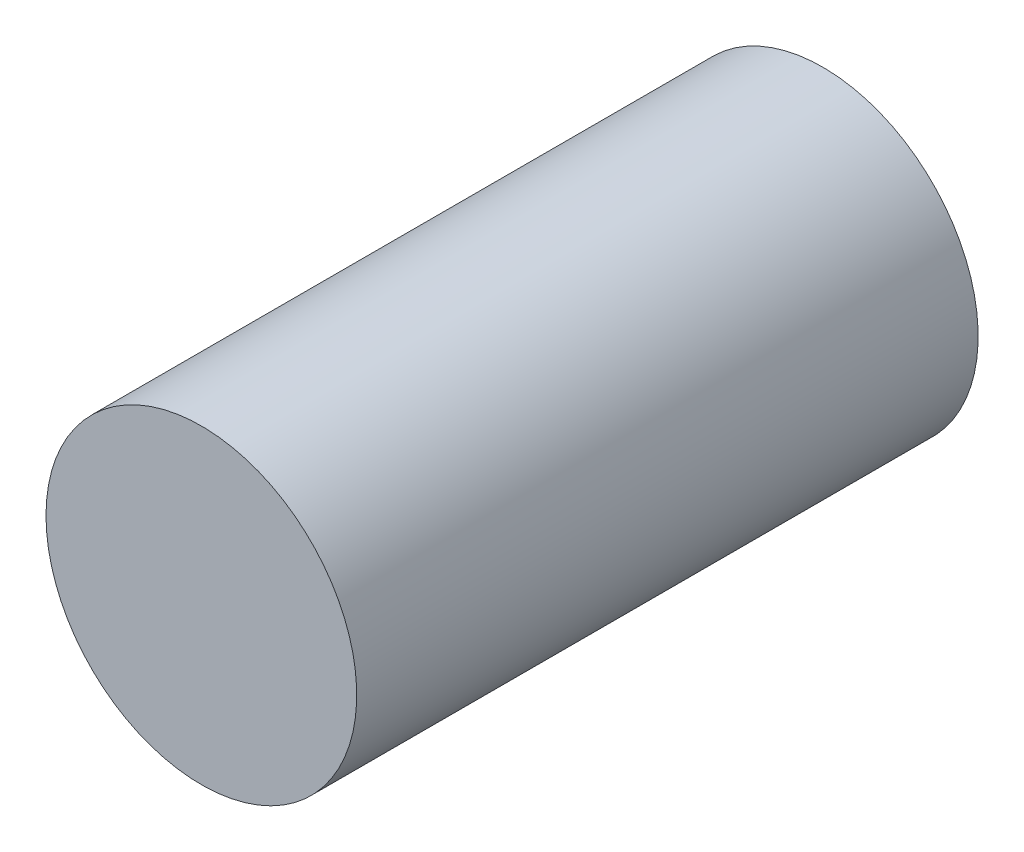
ISO-10303-21;
HEADER;
FILE_DESCRIPTION(('STEP AP214'),'2;1');
FILE_NAME('part.step','',(''),(''),'','','');
FILE_SCHEMA(('AUTOMOTIVE_DESIGN { 1 0 10303 214 1 1 1 1 }'));
ENDSEC;
DATA;
#1=APPLICATION_CONTEXT('core data for automotive mechanical design processes');
#2=APPLICATION_PROTOCOL_DEFINITION('international standard','automotive_design',2000,#1);
#3=PRODUCT_CONTEXT('',#1,'mechanical');
#4=PRODUCT('Part','Part','',(#3));
#5=PRODUCT_RELATED_PRODUCT_CATEGORY('part','',(#4));
#6=PRODUCT_DEFINITION_FORMATION('','',#4);
#7=PRODUCT_DEFINITION_CONTEXT('part definition',#1,'design');
#8=PRODUCT_DEFINITION('design','',#6,#7);
#9=PRODUCT_DEFINITION_SHAPE('','',#8);
#10=(LENGTH_UNIT() NAMED_UNIT(*) SI_UNIT(.MILLI.,.METRE.));
#11=(NAMED_UNIT(*) PLANE_ANGLE_UNIT() SI_UNIT($,.RADIAN.));
#12=(NAMED_UNIT(*) SI_UNIT($,.STERADIAN.) SOLID_ANGLE_UNIT());
#13=UNCERTAINTY_MEASURE_WITH_UNIT(LENGTH_MEASURE(1.E-05),#10,'distance_accuracy_value','');
#14=(GEOMETRIC_REPRESENTATION_CONTEXT(3) GLOBAL_UNCERTAINTY_ASSIGNED_CONTEXT((#13)) GLOBAL_UNIT_ASSIGNED_CONTEXT((#10,
#11,#12)) REPRESENTATION_CONTEXT('',''));
#15=CARTESIAN_POINT('',(0.,0.,0.));
#16=DIRECTION('',(0.,0.,1.));
#17=DIRECTION('',(1.,0.,0.));
#18=AXIS2_PLACEMENT_3D('',#15,#16,#17);
#19=CARTESIAN_POINT('',(0.,0.,26.));
#20=DIRECTION('',(0.,0.,-1.));
#21=DIRECTION('',(-1.,0.,0.));
#22=AXIS2_PLACEMENT_3D('',#19,#20,#21);
#23=CYLINDRICAL_SURFACE('',#22,6.5);
#24=CARTESIAN_POINT('',(0.,0.,26.));
#25=DIRECTION('',(0.,0.,1.));
#26=DIRECTION('',(1.,0.,0.));
#27=AXIS2_PLACEMENT_3D('',#24,#25,#26);
#28=CIRCLE('',#27,6.5);
#29=CARTESIAN_POINT('',(-6.5,0.,26.));
#30=VERTEX_POINT('',#29);
#31=EDGE_CURVE('E10',#30,#30,#28,.T.);
#32=CARTESIAN_POINT('',(0.,0.,0.));
#33=DIRECTION('',(0.,0.,1.));
#34=DIRECTION('',(1.,0.,0.));
#35=AXIS2_PLACEMENT_3D('',#32,#33,#34);
#36=CIRCLE('',#35,6.5);
#37=CARTESIAN_POINT('',(-6.5,0.,0.));
#38=VERTEX_POINT('',#37);
#39=EDGE_CURVE('E40',#38,#38,#36,.T.);
#40=CARTESIAN_POINT('',(-6.5,0.,26.));
#41=CARTESIAN_POINT('',(-6.5,0.,25.7291666666667));
#42=CARTESIAN_POINT('',(-6.5,0.,25.4583333333333));
#43=CARTESIAN_POINT('',(-6.5,0.,24.9166666666667));
#44=CARTESIAN_POINT('',(-6.5,0.,24.6458333333333));
#45=CARTESIAN_POINT('',(-6.5,0.,24.1041666666667));
#46=CARTESIAN_POINT('',(-6.5,0.,23.8333333333333));
#47=CARTESIAN_POINT('',(-6.5,0.,23.2916666666667));
#48=CARTESIAN_POINT('',(-6.5,0.,23.0208333333333));
#49=CARTESIAN_POINT('',(-6.5,0.,22.4791666666667));
#50=CARTESIAN_POINT('',(-6.5,0.,22.2083333333333));
#51=CARTESIAN_POINT('',(-6.5,0.,21.6666666666667));
#52=CARTESIAN_POINT('',(-6.5,0.,21.3958333333333));
#53=CARTESIAN_POINT('',(-6.5,0.,20.8541666666667));
#54=CARTESIAN_POINT('',(-6.5,0.,20.5833333333333));
#55=CARTESIAN_POINT('',(-6.5,0.,20.0416666666667));
#56=CARTESIAN_POINT('',(-6.5,0.,19.7708333333333));
#57=CARTESIAN_POINT('',(-6.5,0.,19.2291666666667));
#58=CARTESIAN_POINT('',(-6.5,0.,18.9583333333333));
#59=CARTESIAN_POINT('',(-6.5,0.,18.4166666666667));
#60=CARTESIAN_POINT('',(-6.5,0.,18.1458333333333));
#61=CARTESIAN_POINT('',(-6.5,0.,17.6041666666667));
#62=CARTESIAN_POINT('',(-6.5,0.,17.3333333333333));
#63=CARTESIAN_POINT('',(-6.5,0.,16.7916666666667));
#64=CARTESIAN_POINT('',(-6.5,0.,16.5208333333333));
#65=CARTESIAN_POINT('',(-6.5,0.,15.9791666666667));
#66=CARTESIAN_POINT('',(-6.5,0.,15.7083333333333));
#67=CARTESIAN_POINT('',(-6.5,0.,15.1666666666667));
#68=CARTESIAN_POINT('',(-6.5,0.,14.8958333333333));
#69=CARTESIAN_POINT('',(-6.5,0.,14.3541666666667));
#70=CARTESIAN_POINT('',(-6.5,0.,14.0833333333333));
#71=CARTESIAN_POINT('',(-6.5,0.,13.5416666666667));
#72=CARTESIAN_POINT('',(-6.5,0.,13.2708333333333));
#73=CARTESIAN_POINT('',(-6.5,0.,12.7291666666667));
#74=CARTESIAN_POINT('',(-6.5,0.,12.4583333333333));
#75=CARTESIAN_POINT('',(-6.5,0.,11.9166666666667));
#76=CARTESIAN_POINT('',(-6.5,0.,11.6458333333333));
#77=CARTESIAN_POINT('',(-6.5,0.,11.1041666666667));
#78=CARTESIAN_POINT('',(-6.5,0.,10.8333333333333));
#79=CARTESIAN_POINT('',(-6.5,0.,10.2916666666667));
#80=CARTESIAN_POINT('',(-6.5,0.,10.0208333333333));
#81=CARTESIAN_POINT('',(-6.5,0.,9.47916666666667));
#82=CARTESIAN_POINT('',(-6.5,0.,9.20833333333333));
#83=CARTESIAN_POINT('',(-6.5,0.,8.66666666666667));
#84=CARTESIAN_POINT('',(-6.5,0.,8.39583333333333));
#85=CARTESIAN_POINT('',(-6.5,0.,7.85416666666667));
#86=CARTESIAN_POINT('',(-6.5,0.,7.58333333333333));
#87=CARTESIAN_POINT('',(-6.5,0.,7.04166666666667));
#88=CARTESIAN_POINT('',(-6.5,0.,6.77083333333333));
#89=CARTESIAN_POINT('',(-6.5,0.,6.22916666666667));
#90=CARTESIAN_POINT('',(-6.5,0.,5.95833333333333));
#91=CARTESIAN_POINT('',(-6.5,0.,5.41666666666667));
#92=CARTESIAN_POINT('',(-6.5,0.,5.14583333333333));
#93=CARTESIAN_POINT('',(-6.5,0.,4.60416666666667));
#94=CARTESIAN_POINT('',(-6.5,0.,4.33333333333333));
#95=CARTESIAN_POINT('',(-6.5,0.,3.79166666666667));
#96=CARTESIAN_POINT('',(-6.5,0.,3.52083333333333));
#97=CARTESIAN_POINT('',(-6.5,0.,2.97916666666667));
#98=CARTESIAN_POINT('',(-6.5,0.,2.70833333333333));
#99=CARTESIAN_POINT('',(-6.5,0.,2.16666666666667));
#100=CARTESIAN_POINT('',(-6.5,0.,1.89583333333333));
#101=CARTESIAN_POINT('',(-6.5,0.,1.35416666666667));
#102=CARTESIAN_POINT('',(-6.5,0.,1.08333333333333));
#103=CARTESIAN_POINT('',(-6.5,0.,0.541666666666667));
#104=CARTESIAN_POINT('',(-6.5,0.,0.270833333333334));
#105=CARTESIAN_POINT('',(-6.5,0.,0.));
#106=B_SPLINE_CURVE_WITH_KNOTS('',3,(#40,#41,#42,#43,#44,#45,#46,#47,#48,#49,#50,#51,#52,#53,
#54,#55,#56,#57,#58,#59,#60,#61,#62,#63,#64,#65,#66,#67,#68,#69,#70,#71,#72,#73,#74,#75,#76,#77,
#78,#79,#80,#81,#82,#83,#84,#85,#86,#87,#88,#89,#90,#91,#92,#93,#94,#95,#96,#97,#98,#99,#100,
#101,#102,#103,#104,#105),.UNSPECIFIED.,.F.,.F.,(4,2,2,2,2,2,2,2,2,2,2,2,2,2,2,2,2,2,2,2,2,2,2,
2,2,2,2,2,2,2,2,2,4),(0.,0.812499999999997,1.625,2.4375,3.25,4.0625,4.875,5.6875,6.5,7.3125,
8.125,8.93749999999999,9.74999999999999,10.5625,11.375,12.1875,13.,13.8125,14.625,15.4375,16.25,
17.0625,17.875,18.6875,19.5,20.3125,21.125,21.9375,22.75,23.5625,24.375,25.1875,26.),.UNSPECIFIED.);
#107=EDGE_CURVE('BSEAM37',#30,#38,#106,.T.);
#108=ORIENTED_EDGE('',*,*,#31,.F.);
#109=ORIENTED_EDGE('',*,*,#39,.T.);
#110=ORIENTED_EDGE('',*,*,#107,.T.);
#111=ORIENTED_EDGE('',*,*,#107,.F.);
#112=EDGE_LOOP('',(#108,#110,#109,#111));
#113=FACE_BOUND('',#112,.T.);
#114=ADVANCED_FACE('F37',(#113),#23,.T.);
#115=CARTESIAN_POINT('',(0.,0.,26.));
#116=DIRECTION('',(0.,0.,1.));
#117=DIRECTION('',(1.,0.,0.));
#118=AXIS2_PLACEMENT_3D('',#115,#116,#117);
#119=PLANE('',#118);
#120=ORIENTED_EDGE('',*,*,#31,.T.);
#121=EDGE_LOOP('',(#120));
#122=FACE_BOUND('',#121,.T.);
#123=ADVANCED_FACE('F52',(#122),#119,.T.);
#124=CARTESIAN_POINT('',(0.,0.,0.));
#125=DIRECTION('',(0.,0.,1.));
#126=DIRECTION('',(1.,0.,0.));
#127=AXIS2_PLACEMENT_3D('',#124,#125,#126);
#128=PLANE('',#127);
#129=ORIENTED_EDGE('',*,*,#39,.F.);
#130=EDGE_LOOP('',(#129));
#131=FACE_BOUND('',#130,.T.);
#132=ADVANCED_FACE('F50',(#131),#128,.F.);
#133=CLOSED_SHELL('',(#114,#123,#132));
#134=MANIFOLD_SOLID_BREP('B2',#133);
#135=ADVANCED_BREP_SHAPE_REPRESENTATION('',(#18,#134),#14);
#136=SHAPE_DEFINITION_REPRESENTATION(#9,#135);
ENDSEC;
END-ISO-10303-21;
